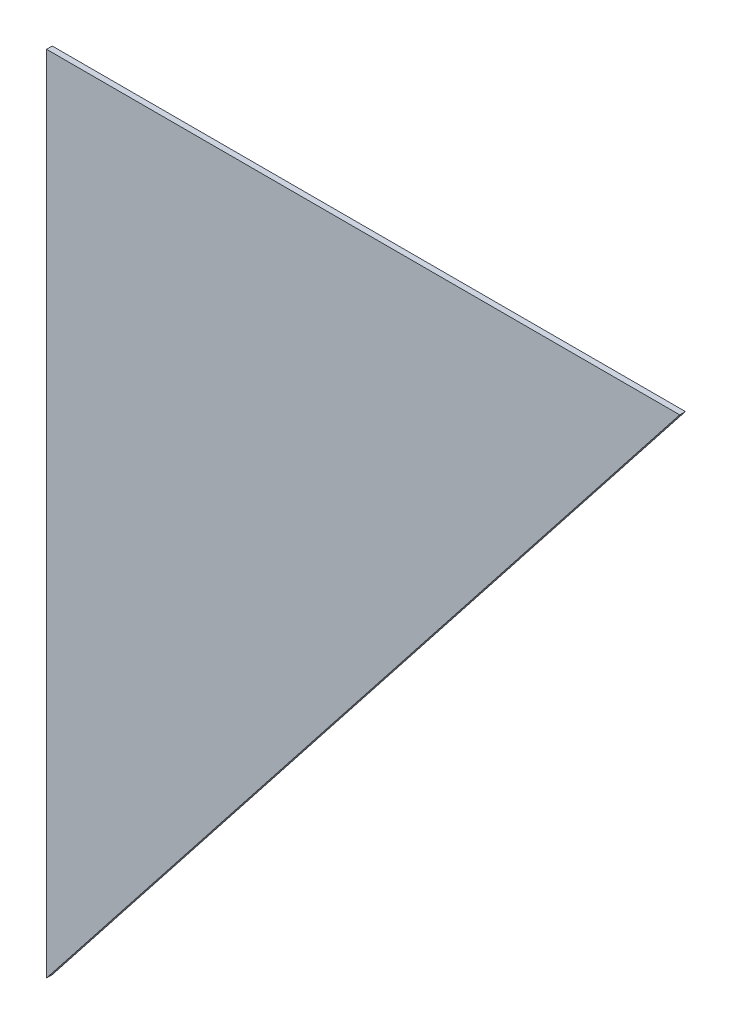
ISO-10303-21;
HEADER;
FILE_DESCRIPTION(('STEP AP214'),'2;1');
FILE_NAME('part.step','',(''),(''),'','','');
FILE_SCHEMA(('AUTOMOTIVE_DESIGN { 1 0 10303 214 1 1 1 1 }'));
ENDSEC;
DATA;
#1=APPLICATION_CONTEXT('core data for automotive mechanical design processes');
#2=APPLICATION_PROTOCOL_DEFINITION('international standard','automotive_design',2000,#1);
#3=PRODUCT_CONTEXT('',#1,'mechanical');
#4=PRODUCT('Part','Part','',(#3));
#5=PRODUCT_RELATED_PRODUCT_CATEGORY('part','',(#4));
#6=PRODUCT_DEFINITION_FORMATION('','',#4);
#7=PRODUCT_DEFINITION_CONTEXT('part definition',#1,'design');
#8=PRODUCT_DEFINITION('design','',#6,#7);
#9=PRODUCT_DEFINITION_SHAPE('','',#8);
#10=(LENGTH_UNIT() NAMED_UNIT(*) SI_UNIT(.MILLI.,.METRE.));
#11=(NAMED_UNIT(*) PLANE_ANGLE_UNIT() SI_UNIT($,.RADIAN.));
#12=(NAMED_UNIT(*) SI_UNIT($,.STERADIAN.) SOLID_ANGLE_UNIT());
#13=UNCERTAINTY_MEASURE_WITH_UNIT(LENGTH_MEASURE(1.E-05),#10,'distance_accuracy_value','');
#14=(GEOMETRIC_REPRESENTATION_CONTEXT(3) GLOBAL_UNCERTAINTY_ASSIGNED_CONTEXT((#13)) GLOBAL_UNIT_ASSIGNED_CONTEXT((#10,
#11,#12)) REPRESENTATION_CONTEXT('',''));
#15=CARTESIAN_POINT('',(0.,0.,0.));
#16=DIRECTION('',(0.,0.,1.));
#17=DIRECTION('',(1.,0.,0.));
#18=AXIS2_PLACEMENT_3D('',#15,#16,#17);
#19=CARTESIAN_POINT('',(0.,0.,0.));
#20=DIRECTION('',(0.,0.,-1.));
#21=DIRECTION('',(-1.,0.,0.));
#22=AXIS2_PLACEMENT_3D('',#19,#20,#21);
#23=PLANE('',#22);
#24=DIRECTION('',(0.,1.,0.));
#25=VECTOR('',#24,1.);
#26=CARTESIAN_POINT('',(-26.3990924796801,125.81172734144,0.));
#27=LINE('',#26,#25);
#28=CARTESIAN_POINT('',(-26.3990924796801,-15.1882726585599,0.));
#29=VERTEX_POINT('',#28);
#30=CARTESIAN_POINT('',(-26.3990924796801,125.81172734144,0.));
#31=VERTEX_POINT('',#30);
#32=EDGE_CURVE('E54',#29,#31,#27,.T.);
#33=ORIENTED_EDGE('',*,*,#32,.T.);
#34=DIRECTION('',(1.,0.,0.));
#35=VECTOR('',#34,1.);
#36=CARTESIAN_POINT('',(84.6009075203199,125.81172734144,0.));
#37=LINE('',#36,#35);
#38=CARTESIAN_POINT('',(84.60090752032,125.81172734144,0.));
#39=VERTEX_POINT('',#38);
#40=EDGE_CURVE('E19',#31,#39,#37,.T.);
#41=ORIENTED_EDGE('',*,*,#40,.T.);
#42=DIRECTION('',(-0.618559606331262,-0.785737878312682,0.));
#43=VECTOR('',#42,1.);
#44=CARTESIAN_POINT('',(-26.3990924796801,-15.1882726585599,0.));
#45=LINE('',#44,#43);
#46=EDGE_CURVE('E53',#39,#29,#45,.T.);
#47=ORIENTED_EDGE('',*,*,#46,.T.);
#48=EDGE_LOOP('',(#33,#41,#47));
#49=FACE_BOUND('',#48,.T.);
#50=ADVANCED_FACE('F16',(#49),#23,.T.);
#51=CARTESIAN_POINT('',(84.6009075203199,125.81172734144,1.));
#52=DIRECTION('',(0.,-1.,0.));
#53=DIRECTION('',(1.,0.,0.));
#54=AXIS2_PLACEMENT_3D('',#51,#52,#53);
#55=PLANE('',#54);
#56=DIRECTION('',(0.,0.,1.));
#57=VECTOR('',#56,1.);
#58=CARTESIAN_POINT('',(-26.3990924796801,125.81172734144,1.));
#59=LINE('',#58,#57);
#60=CARTESIAN_POINT('',(-26.3990924796801,125.81172734144,1.));
#61=VERTEX_POINT('',#60);
#62=EDGE_CURVE('E60',#31,#61,#59,.T.);
#63=ORIENTED_EDGE('',*,*,#62,.T.);
#64=DIRECTION('',(-1.,0.,0.));
#65=VECTOR('',#64,1.);
#66=CARTESIAN_POINT('',(0.,125.81172734144,1.));
#67=LINE('',#66,#65);
#68=CARTESIAN_POINT('',(84.60090752032,125.81172734144,1.));
#69=VERTEX_POINT('',#68);
#70=EDGE_CURVE('E64',#61,#69,#67,.F.);
#71=ORIENTED_EDGE('',*,*,#70,.T.);
#72=DIRECTION('',(0.,0.,1.));
#73=VECTOR('',#72,1.);
#74=CARTESIAN_POINT('',(84.6009075203199,125.81172734144,0.));
#75=LINE('',#74,#73);
#76=EDGE_CURVE('E55',#69,#39,#75,.F.);
#77=ORIENTED_EDGE('',*,*,#76,.T.);
#78=ORIENTED_EDGE('',*,*,#40,.F.);
#79=EDGE_LOOP('',(#63,#71,#77,#78));
#80=FACE_BOUND('',#79,.T.);
#81=ADVANCED_FACE('F63',(#80),#55,.F.);
#82=CARTESIAN_POINT('',(-26.3990924796801,-15.1882726585599,0.));
#83=DIRECTION('',(-0.785737878312682,0.618559606331262,0.));
#84=DIRECTION('',(-0.618559606331262,-0.785737878312682,0.));
#85=AXIS2_PLACEMENT_3D('',#82,#83,#84);
#86=PLANE('',#85);
#87=DIRECTION('',(0.,0.,1.));
#88=VECTOR('',#87,1.);
#89=CARTESIAN_POINT('',(-26.3990924796801,-15.1882726585599,1.));
#90=LINE('',#89,#88);
#91=CARTESIAN_POINT('',(-26.3990924796801,-15.1882726585599,1.));
#92=VERTEX_POINT('',#91);
#93=EDGE_CURVE('E33',#92,#29,#90,.F.);
#94=ORIENTED_EDGE('',*,*,#93,.T.);
#95=ORIENTED_EDGE('',*,*,#46,.F.);
#96=ORIENTED_EDGE('',*,*,#76,.F.);
#97=DIRECTION('',(-0.618559606331262,-0.785737878312682,0.));
#98=VECTOR('',#97,1.);
#99=CARTESIAN_POINT('',(84.6009075203199,125.81172734144,1.));
#100=LINE('',#99,#98);
#101=EDGE_CURVE('E25',#69,#92,#100,.T.);
#102=ORIENTED_EDGE('',*,*,#101,.T.);
#103=EDGE_LOOP('',(#94,#95,#96,#102));
#104=FACE_BOUND('',#103,.T.);
#105=ADVANCED_FACE('F57',(#104),#86,.F.);
#106=CARTESIAN_POINT('',(-26.3990924796801,125.81172734144,1.));
#107=DIRECTION('',(1.,0.,0.));
#108=DIRECTION('',(0.,1.,0.));
#109=AXIS2_PLACEMENT_3D('',#106,#107,#108);
#110=PLANE('',#109);
#111=ORIENTED_EDGE('',*,*,#93,.F.);
#112=DIRECTION('',(0.,1.,0.));
#113=VECTOR('',#112,1.);
#114=CARTESIAN_POINT('',(-26.3990924796801,0.,1.));
#115=LINE('',#114,#113);
#116=EDGE_CURVE('E11',#92,#61,#115,.T.);
#117=ORIENTED_EDGE('',*,*,#116,.T.);
#118=ORIENTED_EDGE('',*,*,#62,.F.);
#119=ORIENTED_EDGE('',*,*,#32,.F.);
#120=EDGE_LOOP('',(#111,#117,#118,#119));
#121=FACE_BOUND('',#120,.T.);
#122=ADVANCED_FACE('F72',(#121),#110,.F.);
#123=CARTESIAN_POINT('',(0.,0.,1.));
#124=DIRECTION('',(0.,0.,-1.));
#125=DIRECTION('',(-1.,0.,0.));
#126=AXIS2_PLACEMENT_3D('',#123,#124,#125);
#127=PLANE('',#126);
#128=ORIENTED_EDGE('',*,*,#101,.F.);
#129=ORIENTED_EDGE('',*,*,#70,.F.);
#130=ORIENTED_EDGE('',*,*,#116,.F.);
#131=EDGE_LOOP('',(#128,#129,#130));
#132=FACE_BOUND('',#131,.T.);
#133=ADVANCED_FACE('F71',(#132),#127,.F.);
#134=CLOSED_SHELL('',(#50,#81,#105,#122,#133));
#135=MANIFOLD_SOLID_BREP('B1',#134);
#136=ADVANCED_BREP_SHAPE_REPRESENTATION('',(#18,#135),#14);
#137=SHAPE_DEFINITION_REPRESENTATION(#9,#136);
ENDSEC;
END-ISO-10303-21;
